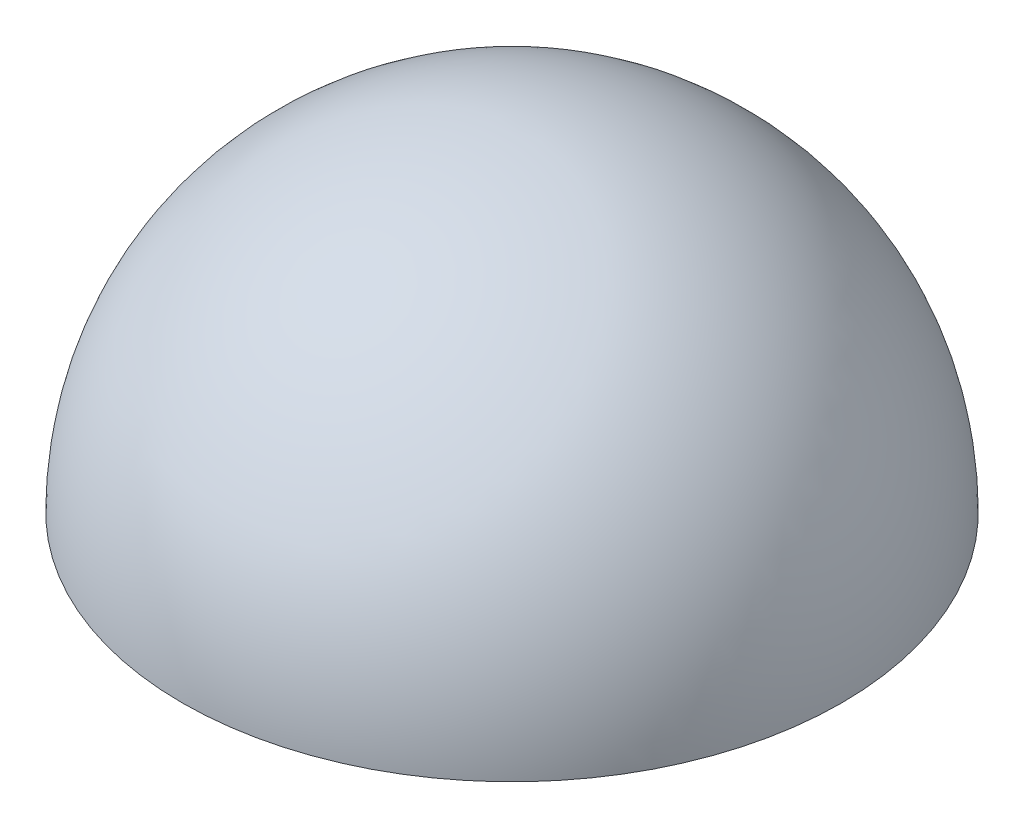
ISO-10303-21;
HEADER;
FILE_DESCRIPTION(('STEP AP214'),'2;1');
FILE_NAME('part.step','',(''),(''),'','','');
FILE_SCHEMA(('AUTOMOTIVE_DESIGN { 1 0 10303 214 1 1 1 1 }'));
ENDSEC;
DATA;
#1=APPLICATION_CONTEXT('core data for automotive mechanical design processes');
#2=APPLICATION_PROTOCOL_DEFINITION('international standard','automotive_design',2000,#1);
#3=PRODUCT_CONTEXT('',#1,'mechanical');
#4=PRODUCT('Part','Part','',(#3));
#5=PRODUCT_RELATED_PRODUCT_CATEGORY('part','',(#4));
#6=PRODUCT_DEFINITION_FORMATION('','',#4);
#7=PRODUCT_DEFINITION_CONTEXT('part definition',#1,'design');
#8=PRODUCT_DEFINITION('design','',#6,#7);
#9=PRODUCT_DEFINITION_SHAPE('','',#8);
#10=(LENGTH_UNIT() NAMED_UNIT(*) SI_UNIT(.MILLI.,.METRE.));
#11=(NAMED_UNIT(*) PLANE_ANGLE_UNIT() SI_UNIT($,.RADIAN.));
#12=(NAMED_UNIT(*) SI_UNIT($,.STERADIAN.) SOLID_ANGLE_UNIT());
#13=UNCERTAINTY_MEASURE_WITH_UNIT(LENGTH_MEASURE(1.E-05),#10,'distance_accuracy_value','');
#14=(GEOMETRIC_REPRESENTATION_CONTEXT(3) GLOBAL_UNCERTAINTY_ASSIGNED_CONTEXT((#13)) GLOBAL_UNIT_ASSIGNED_CONTEXT((#10,
#11,#12)) REPRESENTATION_CONTEXT('',''));
#15=CARTESIAN_POINT('',(0.,0.,0.));
#16=DIRECTION('',(0.,0.,1.));
#17=DIRECTION('',(1.,0.,0.));
#18=AXIS2_PLACEMENT_3D('',#15,#16,#17);
#19=CARTESIAN_POINT('',(0.,0.,0.));
#20=DIRECTION('',(0.,-1.,0.));
#21=DIRECTION('',(1.,0.,0.));
#22=AXIS2_PLACEMENT_3D('',#19,#20,#21);
#23=SPHERICAL_SURFACE('',#22,7.5);
#24=CARTESIAN_POINT('',(0.,0.,0.));
#25=DIRECTION('',(0.,-1.,0.));
#26=DIRECTION('',(0.,0.,-1.));
#27=AXIS2_PLACEMENT_3D('',#24,#25,#26);
#28=CIRCLE('',#27,7.5);
#29=CARTESIAN_POINT('',(0.,0.,-7.5));
#30=VERTEX_POINT('',#29);
#31=EDGE_CURVE('E37',#30,#30,#28,.T.);
#32=ORIENTED_EDGE('',*,*,#31,.F.);
#33=EDGE_LOOP('',(#32));
#34=FACE_BOUND('',#33,.T.);
#35=ADVANCED_FACE('F31',(#34),#23,.T.);
#36=CARTESIAN_POINT('',(0.,0.,0.));
#37=DIRECTION('',(0.,-1.,0.));
#38=DIRECTION('',(1.,0.,0.));
#39=AXIS2_PLACEMENT_3D('',#36,#37,#38);
#40=SPHERICAL_SURFACE('',#39,6.5);
#41=CARTESIAN_POINT('',(0.,0.,0.));
#42=DIRECTION('',(0.,-1.,0.));
#43=DIRECTION('',(0.,0.,-1.));
#44=AXIS2_PLACEMENT_3D('',#41,#42,#43);
#45=CIRCLE('',#44,6.5);
#46=CARTESIAN_POINT('',(0.,0.,-6.5));
#47=VERTEX_POINT('',#46);
#48=EDGE_CURVE('E10',#47,#47,#45,.T.);
#49=ORIENTED_EDGE('',*,*,#48,.T.);
#50=EDGE_LOOP('',(#49));
#51=FACE_BOUND('',#50,.T.);
#52=ADVANCED_FACE('F47',(#51),#40,.F.);
#53=CARTESIAN_POINT('',(6.5,0.,0.));
#54=DIRECTION('',(0.,-1.,0.));
#55=DIRECTION('',(0.,0.,-1.));
#56=AXIS2_PLACEMENT_3D('',#53,#54,#55);
#57=PLANE('',#56);
#58=ORIENTED_EDGE('',*,*,#31,.T.);
#59=EDGE_LOOP('',(#58));
#60=FACE_BOUND('',#59,.T.);
#61=ORIENTED_EDGE('',*,*,#48,.F.);
#62=EDGE_LOOP('',(#61));
#63=FACE_BOUND('',#62,.T.);
#64=ADVANCED_FACE('F43',(#60,#63),#57,.T.);
#65=CLOSED_SHELL('',(#35,#52,#64));
#66=MANIFOLD_SOLID_BREP('B2',#65);
#67=ADVANCED_BREP_SHAPE_REPRESENTATION('',(#18,#66),#14);
#68=SHAPE_DEFINITION_REPRESENTATION(#9,#67);
ENDSEC;
END-ISO-10303-21;
